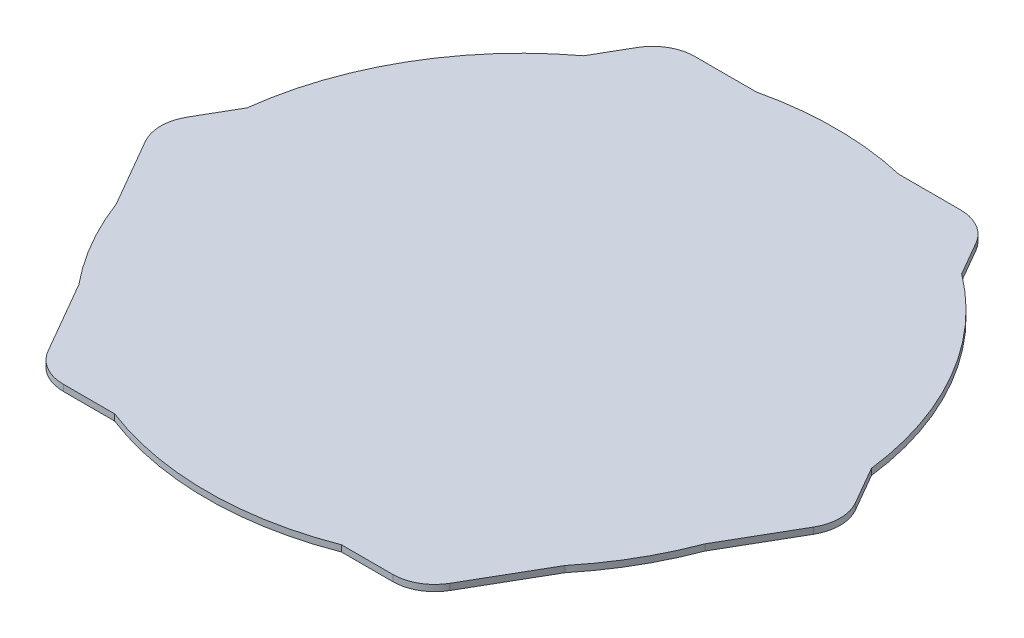
ISO-10303-21;
HEADER;
FILE_DESCRIPTION(('STEP AP214'),'2;1');
FILE_NAME('part.step','',(''),(''),'','','');
FILE_SCHEMA(('AUTOMOTIVE_DESIGN { 1 0 10303 214 1 1 1 1 }'));
ENDSEC;
DATA;
#1=APPLICATION_CONTEXT('core data for automotive mechanical design processes');
#2=APPLICATION_PROTOCOL_DEFINITION('international standard','automotive_design',2000,#1);
#3=PRODUCT_CONTEXT('',#1,'mechanical');
#4=PRODUCT('Part','Part','',(#3));
#5=PRODUCT_RELATED_PRODUCT_CATEGORY('part','',(#4));
#6=PRODUCT_DEFINITION_FORMATION('','',#4);
#7=PRODUCT_DEFINITION_CONTEXT('part definition',#1,'design');
#8=PRODUCT_DEFINITION('design','',#6,#7);
#9=PRODUCT_DEFINITION_SHAPE('','',#8);
#10=(LENGTH_UNIT() NAMED_UNIT(*) SI_UNIT(.MILLI.,.METRE.));
#11=(NAMED_UNIT(*) PLANE_ANGLE_UNIT() SI_UNIT($,.RADIAN.));
#12=(NAMED_UNIT(*) SI_UNIT($,.STERADIAN.) SOLID_ANGLE_UNIT());
#13=UNCERTAINTY_MEASURE_WITH_UNIT(LENGTH_MEASURE(1.E-05),#10,'distance_accuracy_value','');
#14=(GEOMETRIC_REPRESENTATION_CONTEXT(3) GLOBAL_UNCERTAINTY_ASSIGNED_CONTEXT((#13)) GLOBAL_UNIT_ASSIGNED_CONTEXT((#10,
#11,#12)) REPRESENTATION_CONTEXT('',''));
#15=CARTESIAN_POINT('',(0.,0.,0.));
#16=DIRECTION('',(0.,0.,1.));
#17=DIRECTION('',(1.,0.,0.));
#18=AXIS2_PLACEMENT_3D('',#15,#16,#17);
#19=CARTESIAN_POINT('',(-165.122176988227,5.,-129.903810567666));
#20=DIRECTION('',(0.866025403784439,0.,-0.5));
#21=DIRECTION('',(-0.5,0.,-0.866025403784439));
#22=AXIS2_PLACEMENT_3D('',#19,#20,#21);
#23=PLANE('',#22);
#24=DIRECTION('',(0.,-1.,0.));
#25=VECTOR('',#24,1.);
#26=CARTESIAN_POINT('',(-159.348674296331,5.,-119.903810567666));
#27=LINE('',#26,#25);
#28=CARTESIAN_POINT('',(-159.348674296331,8.,-119.903810567666));
#29=VERTEX_POINT('',#28);
#30=CARTESIAN_POINT('',(-159.348674296331,5.,-119.903810567666));
#31=VERTEX_POINT('',#30);
#32=EDGE_CURVE('E208',#29,#31,#27,.T.);
#33=ORIENTED_EDGE('',*,*,#32,.T.);
#34=DIRECTION('',(0.5,0.,0.866025403784439));
#35=VECTOR('',#34,1.);
#36=CARTESIAN_POINT('',(-165.122176988227,5.,-129.903810567666));
#37=LINE('',#36,#35);
#38=CARTESIAN_POINT('',(-140.378315375842,5.,-87.0461850795606));
#39=VERTEX_POINT('',#38);
#40=EDGE_CURVE('E203',#31,#39,#37,.T.);
#41=ORIENTED_EDGE('',*,*,#40,.T.);
#42=DIRECTION('',(0.,-1.,0.));
#43=VECTOR('',#42,1.);
#44=CARTESIAN_POINT('',(-140.378315375841,8.,-87.0461850795603));
#45=LINE('',#44,#43);
#46=CARTESIAN_POINT('',(-140.378315375841,8.,-87.0461850795603));
#47=VERTEX_POINT('',#46);
#48=EDGE_CURVE('E206',#47,#39,#45,.T.);
#49=ORIENTED_EDGE('',*,*,#48,.F.);
#50=DIRECTION('',(0.5,0.,0.866025403784439));
#51=VECTOR('',#50,1.);
#52=CARTESIAN_POINT('',(-67.5916327411705,8.,39.0240473580811));
#53=LINE('',#52,#51);
#54=EDGE_CURVE('E385',#29,#47,#53,.T.);
#55=ORIENTED_EDGE('',*,*,#54,.F.);
#56=EDGE_LOOP('',(#33,#41,#49,#55));
#57=FACE_BOUND('',#56,.T.);
#58=ADVANCED_FACE('F39',(#57),#23,.F.);
#59=CARTESIAN_POINT('',(-90.1221769882273,5.,0.));
#60=DIRECTION('',(0.,0.,-1.));
#61=DIRECTION('',(-1.,0.,0.));
#62=AXIS2_PLACEMENT_3D('',#59,#60,#61);
#63=PLANE('',#62);
#64=DIRECTION('',(0.,-1.,0.));
#65=VECTOR('',#64,1.);
#66=CARTESIAN_POINT('',(-78.5751716044348,5.,0.));
#67=LINE('',#66,#65);
#68=CARTESIAN_POINT('',(-78.5751716044348,8.,0.));
#69=VERTEX_POINT('',#68);
#70=CARTESIAN_POINT('',(-78.5751716044348,5.,0.));
#71=VERTEX_POINT('',#70);
#72=EDGE_CURVE('E323',#69,#71,#67,.T.);
#73=ORIENTED_EDGE('',*,*,#72,.T.);
#74=DIRECTION('',(1.,0.,0.));
#75=VECTOR('',#74,1.);
#76=CARTESIAN_POINT('',(-90.1221769882273,5.,0.));
#77=LINE('',#76,#75);
#78=CARTESIAN_POINT('',(-54.1010516408569,5.,0.));
#79=VERTEX_POINT('',#78);
#80=EDGE_CURVE('E445',#71,#79,#77,.T.);
#81=ORIENTED_EDGE('',*,*,#80,.T.);
#82=DIRECTION('',(0.,-1.,0.));
#83=VECTOR('',#82,1.);
#84=CARTESIAN_POINT('',(-54.1010516408569,8.,0.));
#85=LINE('',#84,#83);
#86=CARTESIAN_POINT('',(-54.1010516408569,8.,0.));
#87=VERTEX_POINT('',#86);
#88=EDGE_CURVE('E308',#87,#79,#85,.T.);
#89=ORIENTED_EDGE('',*,*,#88,.F.);
#90=DIRECTION('',(1.,0.,0.));
#91=VECTOR('',#90,1.);
#92=CARTESIAN_POINT('',(0.,8.,0.));
#93=LINE('',#92,#91);
#94=EDGE_CURVE('E231',#69,#87,#93,.T.);
#95=ORIENTED_EDGE('',*,*,#94,.F.);
#96=EDGE_LOOP('',(#73,#81,#89,#95));
#97=FACE_BOUND('',#96,.T.);
#98=ADVANCED_FACE('F393',(#97),#63,.F.);
#99=CARTESIAN_POINT('',(90.1221769882257,5.,0.));
#100=DIRECTION('',(-0.866025403784434,0.,-0.500000000000008));
#101=DIRECTION('',(-0.500000000000008,0.,0.866025403784434));
#102=AXIS2_PLACEMENT_3D('',#99,#100,#101);
#103=PLANE('',#102);
#104=DIRECTION('',(0.,-1.,0.));
#105=VECTOR('',#104,1.);
#106=CARTESIAN_POINT('',(95.895679680122,5.,-9.99999999999984));
#107=LINE('',#106,#105);
#108=CARTESIAN_POINT('',(95.895679680122,8.,-9.99999999999983));
#109=VERTEX_POINT('',#108);
#110=CARTESIAN_POINT('',(95.895679680122,5.,-9.99999999999983));
#111=VERTEX_POINT('',#110);
#112=EDGE_CURVE('E315',#109,#111,#107,.T.);
#113=ORIENTED_EDGE('',*,*,#112,.T.);
#114=DIRECTION('',(0.500000000000008,0.,-0.866025403784434));
#115=VECTOR('',#114,1.);
#116=CARTESIAN_POINT('',(90.1221769882257,5.,0.));
#117=LINE('',#116,#115);
#118=CARTESIAN_POINT('',(115.965204144341,5.,-44.7614360557728));
#119=VERTEX_POINT('',#118);
#120=EDGE_CURVE('E483',#111,#119,#117,.T.);
#121=ORIENTED_EDGE('',*,*,#120,.T.);
#122=DIRECTION('',(0.,-1.,0.));
#123=VECTOR('',#122,1.);
#124=CARTESIAN_POINT('',(115.965204144341,8.,-44.7614360557729));
#125=LINE('',#124,#123);
#126=CARTESIAN_POINT('',(115.965204144341,8.,-44.7614360557729));
#127=VERTEX_POINT('',#126);
#128=EDGE_CURVE('E294',#127,#119,#125,.T.);
#129=ORIENTED_EDGE('',*,*,#128,.F.);
#130=DIRECTION('',(0.500000000000008,0.,-0.866025403784434));
#131=VECTOR('',#130,1.);
#132=CARTESIAN_POINT('',(67.5916327411685,8.,39.0240473580808));
#133=LINE('',#132,#131);
#134=EDGE_CURVE('E363',#109,#127,#133,.T.);
#135=ORIENTED_EDGE('',*,*,#134,.F.);
#136=EDGE_LOOP('',(#113,#121,#129,#135));
#137=FACE_BOUND('',#136,.T.);
#138=ADVANCED_FACE('F416',(#137),#103,.F.);
#139=CARTESIAN_POINT('',(165.122176988227,5.,-129.903810567666));
#140=DIRECTION('',(-0.866025403784434,0.,0.500000000000007));
#141=DIRECTION('',(0.500000000000007,0.,0.866025403784435));
#142=AXIS2_PLACEMENT_3D('',#139,#140,#141);
#143=PLANE('',#142);
#144=DIRECTION('',(0.,-1.,0.));
#145=VECTOR('',#144,1.);
#146=CARTESIAN_POINT('',(159.348674296331,5.,-139.903810567666));
#147=LINE('',#146,#145);
#148=CARTESIAN_POINT('',(159.348674296331,8.,-139.903810567666));
#149=VERTEX_POINT('',#148);
#150=CARTESIAN_POINT('',(159.348674296331,5.,-139.903810567666));
#151=VERTEX_POINT('',#150);
#152=EDGE_CURVE('E48',#149,#151,#147,.T.);
#153=ORIENTED_EDGE('',*,*,#152,.T.);
#154=DIRECTION('',(-0.500000000000007,0.,-0.866025403784435));
#155=VECTOR('',#154,1.);
#156=CARTESIAN_POINT('',(165.122176988227,5.,-129.903810567666));
#157=LINE('',#156,#155);
#158=CARTESIAN_POINT('',(148.905382635652,5.,-157.992122322221));
#159=VERTEX_POINT('',#158);
#160=EDGE_CURVE('E56',#151,#159,#157,.T.);
#161=ORIENTED_EDGE('',*,*,#160,.T.);
#162=DIRECTION('',(0.,-1.,0.));
#163=VECTOR('',#162,1.);
#164=CARTESIAN_POINT('',(148.905382635652,8.,-157.992122322221));
#165=LINE('',#164,#163);
#166=CARTESIAN_POINT('',(148.905382635652,8.,-157.992122322221));
#167=VERTEX_POINT('',#166);
#168=EDGE_CURVE('E280',#167,#159,#165,.T.);
#169=ORIENTED_EDGE('',*,*,#168,.F.);
#170=DIRECTION('',(-0.500000000000007,0.,-0.866025403784435));
#171=VECTOR('',#170,1.);
#172=CARTESIAN_POINT('',(180.09163274117,8.,-103.975952641916));
#173=LINE('',#172,#171);
#174=EDGE_CURVE('E348',#149,#167,#173,.T.);
#175=ORIENTED_EDGE('',*,*,#174,.F.);
#176=EDGE_LOOP('',(#153,#161,#169,#175));
#177=FACE_BOUND('',#176,.T.);
#178=ADVANCED_FACE('F346',(#177),#143,.F.);
#179=CARTESIAN_POINT('',(74.9999999999926,5.,-286.));
#180=DIRECTION('',(0.,0.,1.));
#181=DIRECTION('',(1.,0.,0.));
#182=AXIS2_PLACEMENT_3D('',#179,#180,#181);
#183=PLANE('',#182);
#184=DIRECTION('',(0.,-1.,0.));
#185=VECTOR('',#184,1.);
#186=CARTESIAN_POINT('',(63.4529946162002,5.,-286.));
#187=LINE('',#186,#185);
#188=CARTESIAN_POINT('',(63.4529946162002,8.,-286.));
#189=VERTEX_POINT('',#188);
#190=CARTESIAN_POINT('',(63.4529946162002,5.,-286.));
#191=VERTEX_POINT('',#190);
#192=EDGE_CURVE('E339',#189,#191,#187,.T.);
#193=ORIENTED_EDGE('',*,*,#192,.T.);
#194=DIRECTION('',(-1.,0.,0.));
#195=VECTOR('',#194,1.);
#196=CARTESIAN_POINT('',(74.9999999999926,5.,-286.));
#197=LINE('',#196,#195);
#198=CARTESIAN_POINT('',(33.998579872571,5.,-286.));
#199=VERTEX_POINT('',#198);
#200=EDGE_CURVE('E466',#191,#199,#197,.T.);
#201=ORIENTED_EDGE('',*,*,#200,.T.);
#202=DIRECTION('',(0.,-1.,0.));
#203=VECTOR('',#202,1.);
#204=CARTESIAN_POINT('',(33.998579872571,8.,-286.));
#205=LINE('',#204,#203);
#206=CARTESIAN_POINT('',(33.998579872571,8.,-286.));
#207=VERTEX_POINT('',#206);
#208=EDGE_CURVE('E265',#207,#199,#205,.T.);
#209=ORIENTED_EDGE('',*,*,#208,.F.);
#210=DIRECTION('',(-1.,0.,0.));
#211=VECTOR('',#210,1.);
#212=CARTESIAN_POINT('',(0.,8.,-286.));
#213=LINE('',#212,#211);
#214=EDGE_CURVE('E370',#189,#207,#213,.T.);
#215=ORIENTED_EDGE('',*,*,#214,.F.);
#216=EDGE_LOOP('',(#193,#201,#209,#215));
#217=FACE_BOUND('',#216,.T.);
#218=ADVANCED_FACE('F440',(#217),#183,.F.);
#219=CARTESIAN_POINT('',(-74.9999999999965,5.,-286.));
#220=DIRECTION('',(0.866025403784444,0.,0.499999999999991));
#221=DIRECTION('',(0.499999999999991,0.,-0.866025403784444));
#222=AXIS2_PLACEMENT_3D('',#219,#220,#221);
#223=PLANE('',#222);
#224=DIRECTION('',(0.,-1.,0.));
#225=VECTOR('',#224,1.);
#226=CARTESIAN_POINT('',(-80.7735026918927,5.,-276.));
#227=LINE('',#226,#225);
#228=CARTESIAN_POINT('',(-80.7735026918927,8.,-276.));
#229=VERTEX_POINT('',#228);
#230=CARTESIAN_POINT('',(-80.7735026918927,5.,-276.));
#231=VERTEX_POINT('',#230);
#232=EDGE_CURVE('E334',#229,#231,#227,.T.);
#233=ORIENTED_EDGE('',*,*,#232,.T.);
#234=DIRECTION('',(-0.499999999999991,0.,0.866025403784444));
#235=VECTOR('',#234,1.);
#236=CARTESIAN_POINT('',(-74.9999999999965,5.,-286.));
#237=LINE('',#236,#235);
#238=CARTESIAN_POINT('',(-90.1176288088474,5.,-259.815498813103));
#239=VERTEX_POINT('',#238);
#240=EDGE_CURVE('E456',#231,#239,#237,.T.);
#241=ORIENTED_EDGE('',*,*,#240,.T.);
#242=DIRECTION('',(0.,-1.,0.));
#243=VECTOR('',#242,1.);
#244=CARTESIAN_POINT('',(-90.1176288088474,8.,-259.815498813103));
#245=LINE('',#244,#243);
#246=CARTESIAN_POINT('',(-90.1176288088474,8.,-259.815498813103));
#247=VERTEX_POINT('',#246);
#248=EDGE_CURVE('E250',#247,#239,#245,.T.);
#249=ORIENTED_EDGE('',*,*,#248,.F.);
#250=DIRECTION('',(-0.499999999999991,0.,0.866025403784444));
#251=VECTOR('',#250,1.);
#252=CARTESIAN_POINT('',(-180.091632741171,8.,-103.975952641912));
#253=LINE('',#252,#251);
#254=EDGE_CURVE('E378',#229,#247,#253,.T.);
#255=ORIENTED_EDGE('',*,*,#254,.F.);
#256=EDGE_LOOP('',(#233,#241,#249,#255));
#257=FACE_BOUND('',#256,.T.);
#258=ADVANCED_FACE('F436',(#257),#223,.F.);
#259=DIRECTION('',(0.,-1.,0.));
#260=VECTOR('',#259,1.);
#261=CARTESIAN_POINT('',(-115.965204144344,8.,-44.7614360557766));
#262=LINE('',#261,#260);
#263=CARTESIAN_POINT('',(-115.965204144344,8.,-44.7614360557766));
#264=VERTEX_POINT('',#263);
#265=CARTESIAN_POINT('',(-115.965204144344,5.,-44.7614360557762));
#266=VERTEX_POINT('',#265);
#267=EDGE_CURVE('E222',#264,#266,#262,.T.);
#268=ORIENTED_EDGE('',*,*,#267,.T.);
#269=CARTESIAN_POINT('',(-95.8956796801236,5.,-10.));
#270=VERTEX_POINT('',#269);
#271=EDGE_CURVE('E226',#266,#270,#37,.T.);
#272=ORIENTED_EDGE('',*,*,#271,.T.);
#273=DIRECTION('',(0.,-1.,0.));
#274=VECTOR('',#273,1.);
#275=CARTESIAN_POINT('',(-95.8956796801235,5.,-9.99999999999998));
#276=LINE('',#275,#274);
#277=CARTESIAN_POINT('',(-95.8956796801235,8.,-10.));
#278=VERTEX_POINT('',#277);
#279=EDGE_CURVE('E64',#270,#278,#276,.F.);
#280=ORIENTED_EDGE('',*,*,#279,.T.);
#281=EDGE_CURVE('E241',#264,#278,#53,.T.);
#282=ORIENTED_EDGE('',*,*,#281,.F.);
#283=EDGE_LOOP('',(#268,#272,#280,#282));
#284=FACE_BOUND('',#283,.T.);
#285=ADVANCED_FACE('F424',(#284),#23,.F.);
#286=DIRECTION('',(0.,-1.,0.));
#287=VECTOR('',#286,1.);
#288=CARTESIAN_POINT('',(54.1010516408569,8.,0.));
#289=LINE('',#288,#287);
#290=CARTESIAN_POINT('',(54.1010516408569,8.,0.));
#291=VERTEX_POINT('',#290);
#292=CARTESIAN_POINT('',(54.1010516408569,5.,0.));
#293=VERTEX_POINT('',#292);
#294=EDGE_CURVE('E299',#291,#293,#289,.T.);
#295=ORIENTED_EDGE('',*,*,#294,.T.);
#296=CARTESIAN_POINT('',(78.5751716044333,5.,0.));
#297=VERTEX_POINT('',#296);
#298=EDGE_CURVE('E490',#293,#297,#77,.T.);
#299=ORIENTED_EDGE('',*,*,#298,.T.);
#300=DIRECTION('',(0.,-1.,0.));
#301=VECTOR('',#300,1.);
#302=CARTESIAN_POINT('',(78.5751716044333,5.,0.));
#303=LINE('',#302,#301);
#304=CARTESIAN_POINT('',(78.5751716044333,8.,0.));
#305=VERTEX_POINT('',#304);
#306=EDGE_CURVE('E330',#297,#305,#303,.F.);
#307=ORIENTED_EDGE('',*,*,#306,.T.);
#308=EDGE_CURVE('E396',#291,#305,#93,.T.);
#309=ORIENTED_EDGE('',*,*,#308,.F.);
#310=EDGE_LOOP('',(#295,#299,#307,#309));
#311=FACE_BOUND('',#310,.T.);
#312=ADVANCED_FACE('F414',(#311),#63,.F.);
#313=DIRECTION('',(0.,-1.,0.));
#314=VECTOR('',#313,1.);
#315=CARTESIAN_POINT('',(140.378315375842,8.,-87.0461850795621));
#316=LINE('',#315,#314);
#317=CARTESIAN_POINT('',(140.378315375842,8.,-87.0461850795621));
#318=VERTEX_POINT('',#317);
#319=CARTESIAN_POINT('',(140.378315375842,5.,-87.0461850795622));
#320=VERTEX_POINT('',#319);
#321=EDGE_CURVE('E285',#318,#320,#316,.T.);
#322=ORIENTED_EDGE('',*,*,#321,.T.);
#323=CARTESIAN_POINT('',(159.348674296331,5.,-119.903810567666));
#324=VERTEX_POINT('',#323);
#325=EDGE_CURVE('E481',#320,#324,#117,.T.);
#326=ORIENTED_EDGE('',*,*,#325,.T.);
#327=DIRECTION('',(0.,-1.,0.));
#328=VECTOR('',#327,1.);
#329=CARTESIAN_POINT('',(159.348674296331,5.,-119.903810567666));
#330=LINE('',#329,#328);
#331=CARTESIAN_POINT('',(159.348674296331,8.,-119.903810567666));
#332=VERTEX_POINT('',#331);
#333=EDGE_CURVE('E311',#324,#332,#330,.F.);
#334=ORIENTED_EDGE('',*,*,#333,.T.);
#335=EDGE_CURVE('E356',#318,#332,#133,.T.);
#336=ORIENTED_EDGE('',*,*,#335,.F.);
#337=EDGE_LOOP('',(#322,#326,#334,#336));
#338=FACE_BOUND('',#337,.T.);
#339=ADVANCED_FACE('F411',(#338),#103,.F.);
#340=DIRECTION('',(0.,-1.,0.));
#341=VECTOR('',#340,1.);
#342=CARTESIAN_POINT('',(90.1176288088419,8.,-259.815498813107));
#343=LINE('',#342,#341);
#344=CARTESIAN_POINT('',(90.1176288088419,8.,-259.815498813107));
#345=VERTEX_POINT('',#344);
#346=CARTESIAN_POINT('',(90.1176288088418,5.,-259.815498813107));
#347=VERTEX_POINT('',#346);
#348=EDGE_CURVE('E270',#345,#347,#343,.T.);
#349=ORIENTED_EDGE('',*,*,#348,.T.);
#350=CARTESIAN_POINT('',(80.7735026918889,5.,-276.));
#351=VERTEX_POINT('',#350);
#352=EDGE_CURVE('E473',#347,#351,#157,.T.);
#353=ORIENTED_EDGE('',*,*,#352,.T.);
#354=DIRECTION('',(0.,-1.,0.));
#355=VECTOR('',#354,1.);
#356=CARTESIAN_POINT('',(80.7735026918889,5.,-276.));
#357=LINE('',#356,#355);
#358=CARTESIAN_POINT('',(80.7735026918889,8.,-276.));
#359=VERTEX_POINT('',#358);
#360=EDGE_CURVE('E11',#351,#359,#357,.F.);
#361=ORIENTED_EDGE('',*,*,#360,.T.);
#362=EDGE_CURVE('E360',#345,#359,#173,.T.);
#363=ORIENTED_EDGE('',*,*,#362,.F.);
#364=EDGE_LOOP('',(#349,#353,#361,#363));
#365=FACE_BOUND('',#364,.T.);
#366=ADVANCED_FACE('F413',(#365),#143,.F.);
#367=DIRECTION('',(0.,-1.,0.));
#368=VECTOR('',#367,1.);
#369=CARTESIAN_POINT('',(-33.998579872571,8.,-286.));
#370=LINE('',#369,#368);
#371=CARTESIAN_POINT('',(-33.998579872571,8.,-286.));
#372=VERTEX_POINT('',#371);
#373=CARTESIAN_POINT('',(-33.998579872571,5.,-286.));
#374=VERTEX_POINT('',#373);
#375=EDGE_CURVE('E255',#372,#374,#370,.T.);
#376=ORIENTED_EDGE('',*,*,#375,.T.);
#377=CARTESIAN_POINT('',(-63.4529946162038,5.,-286.));
#378=VERTEX_POINT('',#377);
#379=EDGE_CURVE('E463',#374,#378,#197,.T.);
#380=ORIENTED_EDGE('',*,*,#379,.T.);
#381=DIRECTION('',(0.,-1.,0.));
#382=VECTOR('',#381,1.);
#383=CARTESIAN_POINT('',(-63.4529946162038,5.,-286.));
#384=LINE('',#383,#382);
#385=CARTESIAN_POINT('',(-63.4529946162038,8.,-286.));
#386=VERTEX_POINT('',#385);
#387=EDGE_CURVE('E342',#378,#386,#384,.F.);
#388=ORIENTED_EDGE('',*,*,#387,.T.);
#389=EDGE_CURVE('E373',#372,#386,#213,.T.);
#390=ORIENTED_EDGE('',*,*,#389,.F.);
#391=EDGE_LOOP('',(#376,#380,#388,#390));
#392=FACE_BOUND('',#391,.T.);
#393=ADVANCED_FACE('F421',(#392),#183,.F.);
#394=DIRECTION('',(0.,-1.,0.));
#395=VECTOR('',#394,1.);
#396=CARTESIAN_POINT('',(-148.905382635652,8.,-157.992122322223));
#397=LINE('',#396,#395);
#398=CARTESIAN_POINT('',(-148.905382635652,8.,-157.992122322223));
#399=VERTEX_POINT('',#398);
#400=CARTESIAN_POINT('',(-148.905382635652,5.,-157.992122322223));
#401=VERTEX_POINT('',#400);
#402=EDGE_CURVE('E221',#399,#401,#397,.T.);
#403=ORIENTED_EDGE('',*,*,#402,.T.);
#404=CARTESIAN_POINT('',(-159.348674296331,5.,-139.903810567666));
#405=VERTEX_POINT('',#404);
#406=EDGE_CURVE('E453',#401,#405,#237,.T.);
#407=ORIENTED_EDGE('',*,*,#406,.T.);
#408=DIRECTION('',(0.,-1.,0.));
#409=VECTOR('',#408,1.);
#410=CARTESIAN_POINT('',(-159.348674296331,5.,-139.903810567666));
#411=LINE('',#410,#409);
#412=CARTESIAN_POINT('',(-159.348674296331,8.,-139.903810567666));
#413=VERTEX_POINT('',#412);
#414=EDGE_CURVE('E337',#405,#413,#411,.F.);
#415=ORIENTED_EDGE('',*,*,#414,.T.);
#416=EDGE_CURVE('E381',#399,#413,#253,.T.);
#417=ORIENTED_EDGE('',*,*,#416,.F.);
#418=EDGE_LOOP('',(#403,#407,#415,#417));
#419=FACE_BOUND('',#418,.T.);
#420=ADVANCED_FACE('F443',(#419),#223,.F.);
#421=CARTESIAN_POINT('',(78.5751716044333,5.,-20.));
#422=DIRECTION('',(0.,-1.,0.));
#423=DIRECTION('',(0.,0.,-1.));
#424=AXIS2_PLACEMENT_3D('',#421,#422,#423);
#425=CYLINDRICAL_SURFACE('',#424,20.);
#426=CARTESIAN_POINT('',(78.5751716044333,5.,-20.));
#427=DIRECTION('',(0.,1.,0.));
#428=DIRECTION('',(0.,0.,1.));
#429=AXIS2_PLACEMENT_3D('',#426,#427,#428);
#430=CIRCLE('',#429,20.);
#431=EDGE_CURVE('E488',#111,#297,#430,.F.);
#432=ORIENTED_EDGE('',*,*,#431,.F.);
#433=ORIENTED_EDGE('',*,*,#112,.F.);
#434=CARTESIAN_POINT('',(78.5751716044333,8.,-20.));
#435=DIRECTION('',(0.,1.,0.));
#436=DIRECTION('',(0.,0.,1.));
#437=AXIS2_PLACEMENT_3D('',#434,#435,#436);
#438=CIRCLE('',#437,20.);
#439=EDGE_CURVE('E399',#305,#109,#438,.T.);
#440=ORIENTED_EDGE('',*,*,#439,.F.);
#441=ORIENTED_EDGE('',*,*,#306,.F.);
#442=EDGE_LOOP('',(#432,#433,#440,#441));
#443=FACE_BOUND('',#442,.T.);
#444=ADVANCED_FACE('F500',(#443),#425,.T.);
#445=CARTESIAN_POINT('',(-78.5751716044348,5.,-20.));
#446=DIRECTION('',(0.,-1.,0.));
#447=DIRECTION('',(0.,0.,-1.));
#448=AXIS2_PLACEMENT_3D('',#445,#446,#447);
#449=CYLINDRICAL_SURFACE('',#448,20.);
#450=CARTESIAN_POINT('',(-78.5751716044348,5.,-20.));
#451=DIRECTION('',(0.,1.,0.));
#452=DIRECTION('',(0.,0.,1.));
#453=AXIS2_PLACEMENT_3D('',#450,#451,#452);
#454=CIRCLE('',#453,20.);
#455=EDGE_CURVE('E391',#71,#270,#454,.F.);
#456=ORIENTED_EDGE('',*,*,#455,.F.);
#457=ORIENTED_EDGE('',*,*,#72,.F.);
#458=CARTESIAN_POINT('',(-78.5751716044348,8.,-20.));
#459=DIRECTION('',(0.,1.,0.));
#460=DIRECTION('',(0.,0.,1.));
#461=AXIS2_PLACEMENT_3D('',#458,#459,#460);
#462=CIRCLE('',#461,20.);
#463=EDGE_CURVE('E227',#278,#69,#462,.T.);
#464=ORIENTED_EDGE('',*,*,#463,.F.);
#465=ORIENTED_EDGE('',*,*,#279,.F.);
#466=EDGE_LOOP('',(#456,#457,#464,#465));
#467=FACE_BOUND('',#466,.T.);
#468=ADVANCED_FACE('F389',(#467),#449,.T.);
#469=CARTESIAN_POINT('',(-142.028166220642,5.,-129.903810567666));
#470=DIRECTION('',(0.,-1.,0.));
#471=DIRECTION('',(0.,0.,-1.));
#472=AXIS2_PLACEMENT_3D('',#469,#470,#471);
#473=CYLINDRICAL_SURFACE('',#472,20.);
#474=CARTESIAN_POINT('',(-142.028166220642,5.,-129.903810567666));
#475=DIRECTION('',(0.,1.,0.));
#476=DIRECTION('',(0.,0.,1.));
#477=AXIS2_PLACEMENT_3D('',#474,#475,#476);
#478=CIRCLE('',#477,20.);
#479=EDGE_CURVE('E212',#31,#405,#478,.F.);
#480=ORIENTED_EDGE('',*,*,#479,.F.);
#481=ORIENTED_EDGE('',*,*,#32,.F.);
#482=CARTESIAN_POINT('',(-142.028166220642,8.,-129.903810567666));
#483=DIRECTION('',(0.,1.,0.));
#484=DIRECTION('',(0.,0.,1.));
#485=AXIS2_PLACEMENT_3D('',#482,#483,#484);
#486=CIRCLE('',#485,20.);
#487=EDGE_CURVE('E383',#413,#29,#486,.T.);
#488=ORIENTED_EDGE('',*,*,#487,.F.);
#489=ORIENTED_EDGE('',*,*,#414,.F.);
#490=EDGE_LOOP('',(#480,#481,#488,#489));
#491=FACE_BOUND('',#490,.T.);
#492=ADVANCED_FACE('F506',(#491),#473,.T.);
#493=CARTESIAN_POINT('',(-63.4529946162038,5.,-266.));
#494=DIRECTION('',(0.,-1.,0.));
#495=DIRECTION('',(0.,0.,-1.));
#496=AXIS2_PLACEMENT_3D('',#493,#494,#495);
#497=CYLINDRICAL_SURFACE('',#496,20.);
#498=CARTESIAN_POINT('',(-63.4529946162038,5.,-266.));
#499=DIRECTION('',(0.,1.,0.));
#500=DIRECTION('',(0.,0.,1.));
#501=AXIS2_PLACEMENT_3D('',#498,#499,#500);
#502=CIRCLE('',#501,20.);
#503=EDGE_CURVE('E461',#231,#378,#502,.F.);
#504=ORIENTED_EDGE('',*,*,#503,.F.);
#505=ORIENTED_EDGE('',*,*,#232,.F.);
#506=CARTESIAN_POINT('',(-63.4529946162038,8.,-266.));
#507=DIRECTION('',(0.,1.,0.));
#508=DIRECTION('',(0.,0.,1.));
#509=AXIS2_PLACEMENT_3D('',#506,#507,#508);
#510=CIRCLE('',#509,20.);
#511=EDGE_CURVE('E375',#386,#229,#510,.T.);
#512=ORIENTED_EDGE('',*,*,#511,.F.);
#513=ORIENTED_EDGE('',*,*,#387,.F.);
#514=EDGE_LOOP('',(#504,#505,#512,#513));
#515=FACE_BOUND('',#514,.T.);
#516=ADVANCED_FACE('F512',(#515),#497,.T.);
#517=CARTESIAN_POINT('',(63.4529946162002,5.,-266.));
#518=DIRECTION('',(0.,-1.,0.));
#519=DIRECTION('',(0.,0.,-1.));
#520=AXIS2_PLACEMENT_3D('',#517,#518,#519);
#521=CYLINDRICAL_SURFACE('',#520,20.);
#522=CARTESIAN_POINT('',(63.4529946162002,5.,-266.));
#523=DIRECTION('',(0.,1.,0.));
#524=DIRECTION('',(0.,0.,1.));
#525=AXIS2_PLACEMENT_3D('',#522,#523,#524);
#526=CIRCLE('',#525,20.);
#527=EDGE_CURVE('E471',#191,#351,#526,.F.);
#528=ORIENTED_EDGE('',*,*,#527,.F.);
#529=ORIENTED_EDGE('',*,*,#192,.F.);
#530=CARTESIAN_POINT('',(63.4529946162002,8.,-266.));
#531=DIRECTION('',(0.,1.,0.));
#532=DIRECTION('',(0.,0.,1.));
#533=AXIS2_PLACEMENT_3D('',#530,#531,#532);
#534=CIRCLE('',#533,20.);
#535=EDGE_CURVE('E367',#359,#189,#534,.T.);
#536=ORIENTED_EDGE('',*,*,#535,.F.);
#537=ORIENTED_EDGE('',*,*,#360,.F.);
#538=EDGE_LOOP('',(#528,#529,#536,#537));
#539=FACE_BOUND('',#538,.T.);
#540=ADVANCED_FACE('F515',(#539),#521,.T.);
#541=CARTESIAN_POINT('',(142.028166220642,5.,-129.903810567666));
#542=DIRECTION('',(0.,-1.,0.));
#543=DIRECTION('',(0.,0.,-1.));
#544=AXIS2_PLACEMENT_3D('',#541,#542,#543);
#545=CYLINDRICAL_SURFACE('',#544,20.);
#546=CARTESIAN_POINT('',(142.028166220642,5.,-129.903810567666));
#547=DIRECTION('',(0.,1.,0.));
#548=DIRECTION('',(0.,0.,1.));
#549=AXIS2_PLACEMENT_3D('',#546,#547,#548);
#550=CIRCLE('',#549,20.);
#551=EDGE_CURVE('E353',#151,#324,#550,.F.);
#552=ORIENTED_EDGE('',*,*,#551,.F.);
#553=ORIENTED_EDGE('',*,*,#152,.F.);
#554=CARTESIAN_POINT('',(142.028166220642,8.,-129.903810567666));
#555=DIRECTION('',(0.,1.,0.));
#556=DIRECTION('',(0.,0.,1.));
#557=AXIS2_PLACEMENT_3D('',#554,#555,#556);
#558=CIRCLE('',#557,20.);
#559=EDGE_CURVE('E352',#332,#149,#558,.T.);
#560=ORIENTED_EDGE('',*,*,#559,.F.);
#561=ORIENTED_EDGE('',*,*,#333,.F.);
#562=EDGE_LOOP('',(#552,#553,#560,#561));
#563=FACE_BOUND('',#562,.T.);
#564=ADVANCED_FACE('F41',(#563),#545,.T.);
#565=CARTESIAN_POINT('',(0.,5.,0.));
#566=DIRECTION('',(0.,1.,0.));
#567=DIRECTION('',(0.,0.,1.));
#568=AXIS2_PLACEMENT_3D('',#565,#566,#567);
#569=PLANE('',#568);
#570=CARTESIAN_POINT('',(0.,5.,-139.903810567666));
#571=DIRECTION('',(0.,1.,0.));
#572=DIRECTION('',(0.,0.,1.));
#573=AXIS2_PLACEMENT_3D('',#570,#571,#572);
#574=CIRCLE('',#573,150.);
#575=EDGE_CURVE('E211',#79,#293,#574,.T.);
#576=ORIENTED_EDGE('',*,*,#575,.F.);
#577=ORIENTED_EDGE('',*,*,#80,.F.);
#578=ORIENTED_EDGE('',*,*,#455,.T.);
#579=ORIENTED_EDGE('',*,*,#271,.F.);
#580=CARTESIAN_POINT('',(0.,5.,-139.903810567666));
#581=DIRECTION('',(0.,1.,0.));
#582=DIRECTION('',(0.,0.,1.));
#583=AXIS2_PLACEMENT_3D('',#580,#581,#582);
#584=CIRCLE('',#583,150.);
#585=EDGE_CURVE('E218',#39,#266,#584,.T.);
#586=ORIENTED_EDGE('',*,*,#585,.F.);
#587=ORIENTED_EDGE('',*,*,#40,.F.);
#588=ORIENTED_EDGE('',*,*,#479,.T.);
#589=ORIENTED_EDGE('',*,*,#406,.F.);
#590=CARTESIAN_POINT('',(0.,5.,-139.903810567666));
#591=DIRECTION('',(0.,1.,0.));
#592=DIRECTION('',(0.,0.,1.));
#593=AXIS2_PLACEMENT_3D('',#590,#591,#592);
#594=CIRCLE('',#593,150.);
#595=EDGE_CURVE('E228',#239,#401,#594,.T.);
#596=ORIENTED_EDGE('',*,*,#595,.F.);
#597=ORIENTED_EDGE('',*,*,#240,.F.);
#598=ORIENTED_EDGE('',*,*,#503,.T.);
#599=ORIENTED_EDGE('',*,*,#379,.F.);
#600=CARTESIAN_POINT('',(0.,5.,-139.903810567666));
#601=DIRECTION('',(0.,1.,0.));
#602=DIRECTION('',(0.,0.,1.));
#603=AXIS2_PLACEMENT_3D('',#600,#601,#602);
#604=CIRCLE('',#603,150.);
#605=EDGE_CURVE('E234',#199,#374,#604,.T.);
#606=ORIENTED_EDGE('',*,*,#605,.F.);
#607=ORIENTED_EDGE('',*,*,#200,.F.);
#608=ORIENTED_EDGE('',*,*,#527,.T.);
#609=ORIENTED_EDGE('',*,*,#352,.F.);
#610=CARTESIAN_POINT('',(0.,5.,-139.903810567666));
#611=DIRECTION('',(0.,1.,0.));
#612=DIRECTION('',(0.,0.,1.));
#613=AXIS2_PLACEMENT_3D('',#610,#611,#612);
#614=CIRCLE('',#613,150.);
#615=EDGE_CURVE('E260',#159,#347,#614,.T.);
#616=ORIENTED_EDGE('',*,*,#615,.F.);
#617=ORIENTED_EDGE('',*,*,#160,.F.);
#618=ORIENTED_EDGE('',*,*,#551,.T.);
#619=ORIENTED_EDGE('',*,*,#325,.F.);
#620=CARTESIAN_POINT('',(0.,5.,-139.903810567666));
#621=DIRECTION('',(0.,1.,0.));
#622=DIRECTION('',(0.,0.,1.));
#623=AXIS2_PLACEMENT_3D('',#620,#621,#622);
#624=CIRCLE('',#623,150.);
#625=EDGE_CURVE('E275',#119,#320,#624,.T.);
#626=ORIENTED_EDGE('',*,*,#625,.F.);
#627=ORIENTED_EDGE('',*,*,#120,.F.);
#628=ORIENTED_EDGE('',*,*,#431,.T.);
#629=ORIENTED_EDGE('',*,*,#298,.F.);
#630=EDGE_LOOP('',(#576,#577,#578,#579,#586,#587,#588,#589,#596,#597,#598,#599,#606,#607,#608,
#609,#616,#617,#618,#619,#626,#627,#628,#629));
#631=FACE_BOUND('',#630,.T.);
#632=ADVANCED_FACE('F225',(#631),#569,.F.);
#633=CARTESIAN_POINT('',(0.,8.,-139.903810567666));
#634=DIRECTION('',(0.,-1.,0.));
#635=DIRECTION('',(0.,0.,-1.));
#636=AXIS2_PLACEMENT_3D('',#633,#634,#635);
#637=CYLINDRICAL_SURFACE('',#636,150.);
#638=ORIENTED_EDGE('',*,*,#575,.T.);
#639=ORIENTED_EDGE('',*,*,#294,.F.);
#640=CARTESIAN_POINT('',(0.,8.,-139.903810567666));
#641=DIRECTION('',(0.,1.,0.));
#642=DIRECTION('',(0.,0.,1.));
#643=AXIS2_PLACEMENT_3D('',#640,#641,#642);
#644=CIRCLE('',#643,150.);
#645=EDGE_CURVE('E394',#87,#291,#644,.T.);
#646=ORIENTED_EDGE('',*,*,#645,.F.);
#647=ORIENTED_EDGE('',*,*,#88,.T.);
#648=EDGE_LOOP('',(#638,#639,#646,#647));
#649=FACE_BOUND('',#648,.T.);
#650=ADVANCED_FACE('F496',(#649),#637,.T.);
#651=CARTESIAN_POINT('',(0.,8.,-139.903810567666));
#652=DIRECTION('',(0.,-1.,0.));
#653=DIRECTION('',(0.,0.,-1.));
#654=AXIS2_PLACEMENT_3D('',#651,#652,#653);
#655=CYLINDRICAL_SURFACE('',#654,150.);
#656=ORIENTED_EDGE('',*,*,#625,.T.);
#657=ORIENTED_EDGE('',*,*,#321,.F.);
#658=CARTESIAN_POINT('',(0.,8.,-139.903810567666));
#659=DIRECTION('',(0.,1.,0.));
#660=DIRECTION('',(0.,0.,1.));
#661=AXIS2_PLACEMENT_3D('',#658,#659,#660);
#662=CIRCLE('',#661,150.);
#663=EDGE_CURVE('E361',#127,#318,#662,.T.);
#664=ORIENTED_EDGE('',*,*,#663,.F.);
#665=ORIENTED_EDGE('',*,*,#128,.T.);
#666=EDGE_LOOP('',(#656,#657,#664,#665));
#667=FACE_BOUND('',#666,.T.);
#668=ADVANCED_FACE('F409',(#667),#655,.T.);
#669=CARTESIAN_POINT('',(0.,8.,-139.903810567666));
#670=DIRECTION('',(0.,-1.,0.));
#671=DIRECTION('',(0.,0.,-1.));
#672=AXIS2_PLACEMENT_3D('',#669,#670,#671);
#673=CYLINDRICAL_SURFACE('',#672,150.);
#674=ORIENTED_EDGE('',*,*,#615,.T.);
#675=ORIENTED_EDGE('',*,*,#348,.F.);
#676=CARTESIAN_POINT('',(0.,8.,-139.903810567666));
#677=DIRECTION('',(0.,1.,0.));
#678=DIRECTION('',(0.,0.,1.));
#679=AXIS2_PLACEMENT_3D('',#676,#677,#678);
#680=CIRCLE('',#679,150.);
#681=EDGE_CURVE('E358',#167,#345,#680,.T.);
#682=ORIENTED_EDGE('',*,*,#681,.F.);
#683=ORIENTED_EDGE('',*,*,#168,.T.);
#684=EDGE_LOOP('',(#674,#675,#682,#683));
#685=FACE_BOUND('',#684,.T.);
#686=ADVANCED_FACE('F536',(#685),#673,.T.);
#687=CARTESIAN_POINT('',(0.,8.,-139.903810567666));
#688=DIRECTION('',(0.,-1.,0.));
#689=DIRECTION('',(0.,0.,-1.));
#690=AXIS2_PLACEMENT_3D('',#687,#688,#689);
#691=CYLINDRICAL_SURFACE('',#690,150.);
#692=ORIENTED_EDGE('',*,*,#605,.T.);
#693=ORIENTED_EDGE('',*,*,#375,.F.);
#694=CARTESIAN_POINT('',(0.,8.,-139.903810567666));
#695=DIRECTION('',(0.,1.,0.));
#696=DIRECTION('',(0.,0.,1.));
#697=AXIS2_PLACEMENT_3D('',#694,#695,#696);
#698=CIRCLE('',#697,150.);
#699=EDGE_CURVE('E372',#207,#372,#698,.T.);
#700=ORIENTED_EDGE('',*,*,#699,.F.);
#701=ORIENTED_EDGE('',*,*,#208,.T.);
#702=EDGE_LOOP('',(#692,#693,#700,#701));
#703=FACE_BOUND('',#702,.T.);
#704=ADVANCED_FACE('F538',(#703),#691,.T.);
#705=CARTESIAN_POINT('',(0.,8.,-139.903810567666));
#706=DIRECTION('',(0.,-1.,0.));
#707=DIRECTION('',(0.,0.,-1.));
#708=AXIS2_PLACEMENT_3D('',#705,#706,#707);
#709=CYLINDRICAL_SURFACE('',#708,150.);
#710=ORIENTED_EDGE('',*,*,#595,.T.);
#711=ORIENTED_EDGE('',*,*,#402,.F.);
#712=CARTESIAN_POINT('',(0.,8.,-139.903810567666));
#713=DIRECTION('',(0.,1.,0.));
#714=DIRECTION('',(0.,0.,1.));
#715=AXIS2_PLACEMENT_3D('',#712,#713,#714);
#716=CIRCLE('',#715,150.);
#717=EDGE_CURVE('E380',#247,#399,#716,.T.);
#718=ORIENTED_EDGE('',*,*,#717,.F.);
#719=ORIENTED_EDGE('',*,*,#248,.T.);
#720=EDGE_LOOP('',(#710,#711,#718,#719));
#721=FACE_BOUND('',#720,.T.);
#722=ADVANCED_FACE('F544',(#721),#709,.T.);
#723=CARTESIAN_POINT('',(0.,8.,-139.903810567666));
#724=DIRECTION('',(0.,-1.,0.));
#725=DIRECTION('',(0.,0.,-1.));
#726=AXIS2_PLACEMENT_3D('',#723,#724,#725);
#727=CYLINDRICAL_SURFACE('',#726,150.);
#728=ORIENTED_EDGE('',*,*,#585,.T.);
#729=ORIENTED_EDGE('',*,*,#267,.F.);
#730=CARTESIAN_POINT('',(0.,8.,-139.903810567666));
#731=DIRECTION('',(0.,1.,0.));
#732=DIRECTION('',(0.,0.,1.));
#733=AXIS2_PLACEMENT_3D('',#730,#731,#732);
#734=CIRCLE('',#733,150.);
#735=EDGE_CURVE('E220',#47,#264,#734,.T.);
#736=ORIENTED_EDGE('',*,*,#735,.F.);
#737=ORIENTED_EDGE('',*,*,#48,.T.);
#738=EDGE_LOOP('',(#728,#729,#736,#737));
#739=FACE_BOUND('',#738,.T.);
#740=ADVANCED_FACE('F216',(#739),#727,.T.);
#741=CARTESIAN_POINT('',(0.,8.,0.));
#742=DIRECTION('',(0.,1.,0.));
#743=DIRECTION('',(0.,0.,1.));
#744=AXIS2_PLACEMENT_3D('',#741,#742,#743);
#745=PLANE('',#744);
#746=ORIENTED_EDGE('',*,*,#463,.T.);
#747=ORIENTED_EDGE('',*,*,#94,.T.);
#748=ORIENTED_EDGE('',*,*,#645,.T.);
#749=ORIENTED_EDGE('',*,*,#308,.T.);
#750=ORIENTED_EDGE('',*,*,#439,.T.);
#751=ORIENTED_EDGE('',*,*,#134,.T.);
#752=ORIENTED_EDGE('',*,*,#663,.T.);
#753=ORIENTED_EDGE('',*,*,#335,.T.);
#754=ORIENTED_EDGE('',*,*,#559,.T.);
#755=ORIENTED_EDGE('',*,*,#174,.T.);
#756=ORIENTED_EDGE('',*,*,#681,.T.);
#757=ORIENTED_EDGE('',*,*,#362,.T.);
#758=ORIENTED_EDGE('',*,*,#535,.T.);
#759=ORIENTED_EDGE('',*,*,#214,.T.);
#760=ORIENTED_EDGE('',*,*,#699,.T.);
#761=ORIENTED_EDGE('',*,*,#389,.T.);
#762=ORIENTED_EDGE('',*,*,#511,.T.);
#763=ORIENTED_EDGE('',*,*,#254,.T.);
#764=ORIENTED_EDGE('',*,*,#717,.T.);
#765=ORIENTED_EDGE('',*,*,#416,.T.);
#766=ORIENTED_EDGE('',*,*,#487,.T.);
#767=ORIENTED_EDGE('',*,*,#54,.T.);
#768=ORIENTED_EDGE('',*,*,#735,.T.);
#769=ORIENTED_EDGE('',*,*,#281,.T.);
#770=EDGE_LOOP('',(#746,#747,#748,#749,#750,#751,#752,#753,#754,#755,#756,#757,#758,#759,#760,
#761,#762,#763,#764,#765,#766,#767,#768,#769));
#771=FACE_BOUND('',#770,.T.);
#772=ADVANCED_FACE('F355',(#771),#745,.T.);
#773=CLOSED_SHELL('',(#58,#98,#138,#178,#218,#258,#285,#312,#339,#366,#393,#420,#444,#468,#492,
#516,#540,#564,#632,#650,#668,#686,#704,#722,#740,#772));
#774=MANIFOLD_SOLID_BREP('B2',#773);
#775=ADVANCED_BREP_SHAPE_REPRESENTATION('',(#18,#774),#14);
#776=SHAPE_DEFINITION_REPRESENTATION(#9,#775);
ENDSEC;
END-ISO-10303-21;
